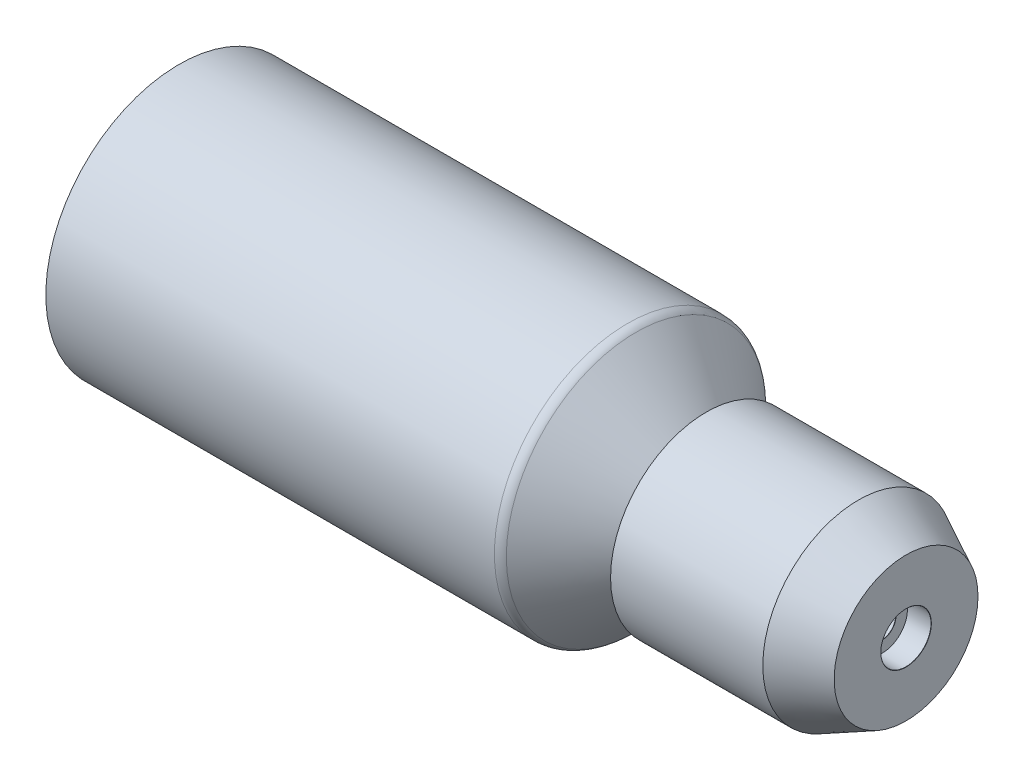
ISO-10303-21;
HEADER;
FILE_DESCRIPTION(('STEP AP214'),'2;1');
FILE_NAME('part.step','',(''),(''),'','','');
FILE_SCHEMA(('AUTOMOTIVE_DESIGN { 1 0 10303 214 1 1 1 1 }'));
ENDSEC;
DATA;
#1=APPLICATION_CONTEXT('core data for automotive mechanical design processes');
#2=APPLICATION_PROTOCOL_DEFINITION('international standard','automotive_design',2000,#1);
#3=PRODUCT_CONTEXT('',#1,'mechanical');
#4=PRODUCT('Part','Part','',(#3));
#5=PRODUCT_RELATED_PRODUCT_CATEGORY('part','',(#4));
#6=PRODUCT_DEFINITION_FORMATION('','',#4);
#7=PRODUCT_DEFINITION_CONTEXT('part definition',#1,'design');
#8=PRODUCT_DEFINITION('design','',#6,#7);
#9=PRODUCT_DEFINITION_SHAPE('','',#8);
#10=(LENGTH_UNIT() NAMED_UNIT(*) SI_UNIT(.MILLI.,.METRE.));
#11=(NAMED_UNIT(*) PLANE_ANGLE_UNIT() SI_UNIT($,.RADIAN.));
#12=(NAMED_UNIT(*) SI_UNIT($,.STERADIAN.) SOLID_ANGLE_UNIT());
#13=UNCERTAINTY_MEASURE_WITH_UNIT(LENGTH_MEASURE(1.E-05),#10,'distance_accuracy_value','');
#14=(GEOMETRIC_REPRESENTATION_CONTEXT(3) GLOBAL_UNCERTAINTY_ASSIGNED_CONTEXT((#13)) GLOBAL_UNIT_ASSIGNED_CONTEXT((#10,
#11,#12)) REPRESENTATION_CONTEXT('',''));
#15=CARTESIAN_POINT('',(0.,0.,0.));
#16=DIRECTION('',(0.,0.,1.));
#17=DIRECTION('',(1.,0.,0.));
#18=AXIS2_PLACEMENT_3D('',#15,#16,#17);
#19=CARTESIAN_POINT('',(-5.82137303331799,0.,0.));
#20=DIRECTION('',(-1.,0.,0.));
#21=DIRECTION('',(0.,0.,1.));
#22=AXIS2_PLACEMENT_3D('',#19,#20,#21);
#23=PLANE('',#22);
#24=CARTESIAN_POINT('',(-5.82137303331799,0.,0.));
#25=DIRECTION('',(-1.,0.,0.));
#26=DIRECTION('',(0.,0.,1.));
#27=AXIS2_PLACEMENT_3D('',#24,#25,#26);
#28=CIRCLE('',#27,1.8);
#29=CARTESIAN_POINT('',(-5.82137303331799,0.,1.8));
#30=VERTEX_POINT('',#29);
#31=EDGE_CURVE('E52',#30,#30,#28,.F.);
#32=ORIENTED_EDGE('',*,*,#31,.T.);
#33=EDGE_LOOP('',(#32));
#34=FACE_BOUND('',#33,.T.);
#35=CARTESIAN_POINT('',(-5.82137303331799,0.,0.));
#36=DIRECTION('',(1.,0.,0.));
#37=DIRECTION('',(0.,0.,-1.));
#38=AXIS2_PLACEMENT_3D('',#35,#36,#37);
#39=CIRCLE('',#38,12.7762);
#40=CARTESIAN_POINT('',(-5.82137303331799,0.,-12.7762));
#41=VERTEX_POINT('',#40);
#42=EDGE_CURVE('E71',#41,#41,#39,.T.);
#43=ORIENTED_EDGE('',*,*,#42,.F.);
#44=EDGE_LOOP('',(#43));
#45=FACE_BOUND('',#44,.T.);
#46=ADVANCED_FACE('F48',(#34,#45),#23,.T.);
#47=CARTESIAN_POINT('',(20.848626966682,0.,0.));
#48=DIRECTION('',(1.,0.,0.));
#49=DIRECTION('',(0.,0.,-1.));
#50=AXIS2_PLACEMENT_3D('',#47,#48,#49);
#51=CYLINDRICAL_SURFACE('',#50,3.35);
#52=CARTESIAN_POINT('',(17.673626966682,0.,0.));
#53=DIRECTION('',(1.,0.,0.));
#54=DIRECTION('',(0.,0.,-1.));
#55=AXIS2_PLACEMENT_3D('',#52,#53,#54);
#56=CIRCLE('',#55,3.35);
#57=CARTESIAN_POINT('',(17.673626966682,0.,-3.35));
#58=VERTEX_POINT('',#57);
#59=EDGE_CURVE('E60',#58,#58,#56,.T.);
#60=ORIENTED_EDGE('',*,*,#59,.F.);
#61=EDGE_LOOP('',(#60));
#62=FACE_BOUND('',#61,.T.);
#63=CARTESIAN_POINT('',(20.823626966682,0.,0.));
#64=DIRECTION('',(1.,0.,0.));
#65=DIRECTION('',(0.,0.,-1.));
#66=AXIS2_PLACEMENT_3D('',#63,#64,#65);
#67=CIRCLE('',#66,3.35);
#68=CARTESIAN_POINT('',(20.823626966682,0.,-3.35));
#69=VERTEX_POINT('',#68);
#70=EDGE_CURVE('E56',#69,#69,#67,.T.);
#71=ORIENTED_EDGE('',*,*,#70,.T.);
#72=EDGE_LOOP('',(#71));
#73=FACE_BOUND('',#72,.T.);
#74=ADVANCED_FACE('F100',(#62,#73),#51,.F.);
#75=CARTESIAN_POINT('',(17.673626966682,1.825,0.));
#76=DIRECTION('',(-1.,0.,0.));
#77=DIRECTION('',(0.,0.,1.));
#78=AXIS2_PLACEMENT_3D('',#75,#76,#77);
#79=PLANE('',#78);
#80=CARTESIAN_POINT('',(17.673626966682,0.,0.));
#81=DIRECTION('',(1.,0.,0.));
#82=DIRECTION('',(0.,0.,-1.));
#83=AXIS2_PLACEMENT_3D('',#80,#81,#82);
#84=CIRCLE('',#83,1.825);
#85=CARTESIAN_POINT('',(17.673626966682,0.,-1.825));
#86=VERTEX_POINT('',#85);
#87=EDGE_CURVE('E65',#86,#86,#84,.T.);
#88=ORIENTED_EDGE('',*,*,#87,.F.);
#89=EDGE_LOOP('',(#88));
#90=FACE_BOUND('',#89,.T.);
#91=ORIENTED_EDGE('',*,*,#59,.T.);
#92=EDGE_LOOP('',(#91));
#93=FACE_BOUND('',#92,.T.);
#94=ADVANCED_FACE('F97',(#90,#93),#79,.F.);
#95=CARTESIAN_POINT('',(17.673626966682,0.,0.));
#96=DIRECTION('',(1.,0.,0.));
#97=DIRECTION('',(0.,0.,-1.));
#98=AXIS2_PLACEMENT_3D('',#95,#96,#97);
#99=CONICAL_SURFACE('',#98,1.825,0.78539816339734);
#100=CARTESIAN_POINT('',(17.648626966682,0.,0.));
#101=DIRECTION('',(1.,0.,0.));
#102=DIRECTION('',(0.,0.,-1.));
#103=AXIS2_PLACEMENT_3D('',#100,#101,#102);
#104=CIRCLE('',#103,1.80000000000001);
#105=CARTESIAN_POINT('',(17.648626966682,0.,-1.80000000000001));
#106=VERTEX_POINT('',#105);
#107=EDGE_CURVE('E68',#106,#106,#104,.T.);
#108=ORIENTED_EDGE('',*,*,#107,.F.);
#109=EDGE_LOOP('',(#108));
#110=FACE_BOUND('',#109,.T.);
#111=ORIENTED_EDGE('',*,*,#87,.T.);
#112=EDGE_LOOP('',(#111));
#113=FACE_BOUND('',#112,.T.);
#114=ADVANCED_FACE('F88',(#110,#113),#99,.F.);
#115=CARTESIAN_POINT('',(-15.6638730333181,0.,0.));
#116=DIRECTION('',(-1.,0.,0.));
#117=DIRECTION('',(0.,0.,1.));
#118=AXIS2_PLACEMENT_3D('',#115,#116,#117);
#119=CYLINDRICAL_SURFACE('',#118,1.8);
#120=ORIENTED_EDGE('',*,*,#107,.T.);
#121=EDGE_LOOP('',(#120));
#122=FACE_BOUND('',#121,.T.);
#123=ORIENTED_EDGE('',*,*,#31,.F.);
#124=EDGE_LOOP('',(#123));
#125=FACE_BOUND('',#124,.T.);
#126=ADVANCED_FACE('F50',(#122,#125),#119,.F.);
#127=CARTESIAN_POINT('',(20.848626966682,0.,0.));
#128=DIRECTION('',(1.,0.,0.));
#129=DIRECTION('',(0.,0.,-1.));
#130=AXIS2_PLACEMENT_3D('',#127,#128,#129);
#131=CONICAL_SURFACE('',#130,3.375,0.785398163397518);
#132=ORIENTED_EDGE('',*,*,#70,.F.);
#133=EDGE_LOOP('',(#132));
#134=FACE_BOUND('',#133,.T.);
#135=CARTESIAN_POINT('',(20.848626966682,0.,0.));
#136=DIRECTION('',(1.,0.,0.));
#137=DIRECTION('',(0.,0.,-1.));
#138=AXIS2_PLACEMENT_3D('',#135,#136,#137);
#139=CIRCLE('',#138,3.375);
#140=CARTESIAN_POINT('',(20.848626966682,0.,-3.375));
#141=VERTEX_POINT('',#140);
#142=EDGE_CURVE('E12',#141,#141,#139,.T.);
#143=ORIENTED_EDGE('',*,*,#142,.T.);
#144=EDGE_LOOP('',(#143));
#145=FACE_BOUND('',#144,.T.);
#146=ADVANCED_FACE('F87',(#134,#145),#131,.F.);
#147=CARTESIAN_POINT('',(20.848626966682,12.7762,0.));
#148=DIRECTION('',(1.,0.,0.));
#149=DIRECTION('',(0.,0.,-1.));
#150=AXIS2_PLACEMENT_3D('',#147,#148,#149);
#151=PLANE('',#150);
#152=ORIENTED_EDGE('',*,*,#142,.F.);
#153=EDGE_LOOP('',(#152));
#154=FACE_BOUND('',#153,.T.);
#155=CARTESIAN_POINT('',(20.848626966682,0.,0.));
#156=DIRECTION('',(1.,0.,0.));
#157=DIRECTION('',(0.,0.,-1.));
#158=AXIS2_PLACEMENT_3D('',#155,#156,#157);
#159=CIRCLE('',#158,9.60119999999998);
#160=CARTESIAN_POINT('',(20.848626966682,0.,-9.60119999999998));
#161=VERTEX_POINT('',#160);
#162=EDGE_CURVE('E74',#161,#161,#159,.T.);
#163=ORIENTED_EDGE('',*,*,#162,.T.);
#164=EDGE_LOOP('',(#163));
#165=FACE_BOUND('',#164,.T.);
#166=ADVANCED_FACE('F94',(#154,#165),#151,.T.);
#167=CARTESIAN_POINT('',(20.848626966682,0.,0.));
#168=DIRECTION('',(-1.,0.,0.));
#169=DIRECTION('',(0.,0.,1.));
#170=AXIS2_PLACEMENT_3D('',#167,#168,#169);
#171=CONICAL_SURFACE('',#170,9.60119999999998,0.463647609000804);
#172=CARTESIAN_POINT('',(14.4986269666819,0.,0.));
#173=DIRECTION('',(1.,0.,0.));
#174=DIRECTION('',(0.,0.,-1.));
#175=AXIS2_PLACEMENT_3D('',#172,#173,#174);
#176=CIRCLE('',#175,12.7762);
#177=CARTESIAN_POINT('',(14.4986269666819,0.,-12.7762));
#178=VERTEX_POINT('',#177);
#179=EDGE_CURVE('E77',#178,#178,#176,.F.);
#180=ORIENTED_EDGE('',*,*,#179,.F.);
#181=EDGE_LOOP('',(#180));
#182=FACE_BOUND('',#181,.T.);
#183=ORIENTED_EDGE('',*,*,#162,.F.);
#184=EDGE_LOOP('',(#183));
#185=FACE_BOUND('',#184,.T.);
#186=ADVANCED_FACE('F116',(#182,#185),#171,.T.);
#187=CARTESIAN_POINT('',(24.17211464598,0.,0.));
#188=DIRECTION('',(1.,0.,0.));
#189=DIRECTION('',(0.,0.,-1.));
#190=AXIS2_PLACEMENT_3D('',#187,#188,#189);
#191=CYLINDRICAL_SURFACE('',#190,12.7762);
#192=ORIENTED_EDGE('',*,*,#179,.T.);
#193=EDGE_LOOP('',(#192));
#194=FACE_BOUND('',#193,.T.);
#195=ORIENTED_EDGE('',*,*,#42,.T.);
#196=EDGE_LOOP('',(#195));
#197=FACE_BOUND('',#196,.T.);
#198=ADVANCED_FACE('F110',(#194,#197),#191,.T.);
#199=CLOSED_SHELL('',(#46,#74,#94,#114,#126,#146,#166,#186,#198));
#200=MANIFOLD_SOLID_BREP('B2',#199);
#201=CARTESIAN_POINT('',(-5.82137303331799,0.,0.));
#202=DIRECTION('',(-1.,0.,0.));
#203=DIRECTION('',(0.,0.,1.));
#204=AXIS2_PLACEMENT_3D('',#201,#202,#203);
#205=PLANE('',#204);
#206=CARTESIAN_POINT('',(-5.82137303331799,0.,0.));
#207=DIRECTION('',(1.,0.,0.));
#208=DIRECTION('',(0.,0.,-1.));
#209=AXIS2_PLACEMENT_3D('',#206,#207,#208);
#210=CIRCLE('',#209,7.9375);
#211=CARTESIAN_POINT('',(-5.82137303331799,0.,-7.9375));
#212=VERTEX_POINT('',#211);
#213=EDGE_CURVE('E47',#212,#212,#210,.T.);
#214=ORIENTED_EDGE('',*,*,#213,.T.);
#215=EDGE_LOOP('',(#214));
#216=FACE_BOUND('',#215,.T.);
#217=CARTESIAN_POINT('',(-5.82137303331799,0.,0.));
#218=DIRECTION('',(-1.,0.,0.));
#219=DIRECTION('',(0.,0.,1.));
#220=AXIS2_PLACEMENT_3D('',#217,#218,#219);
#221=CIRCLE('',#220,1.8);
#222=CARTESIAN_POINT('',(-5.82137303331799,0.,1.8));
#223=VERTEX_POINT('',#222);
#224=EDGE_CURVE('E204',#223,#223,#221,.F.);
#225=ORIENTED_EDGE('',*,*,#224,.F.);
#226=EDGE_LOOP('',(#225));
#227=FACE_BOUND('',#226,.T.);
#228=ADVANCED_FACE('F201',(#216,#227),#205,.F.);
#229=CARTESIAN_POINT('',(-15.6638730333181,0.,0.));
#230=DIRECTION('',(-1.,0.,0.));
#231=DIRECTION('',(0.,0.,1.));
#232=AXIS2_PLACEMENT_3D('',#229,#230,#231);
#233=CYLINDRICAL_SURFACE('',#232,1.8);
#234=ORIENTED_EDGE('',*,*,#224,.T.);
#235=EDGE_LOOP('',(#234));
#236=FACE_BOUND('',#235,.T.);
#237=CARTESIAN_POINT('',(-14.0138730333181,0.,0.));
#238=DIRECTION('',(-1.,0.,0.));
#239=DIRECTION('',(0.,0.,1.));
#240=AXIS2_PLACEMENT_3D('',#237,#238,#239);
#241=CIRCLE('',#240,1.8);
#242=CARTESIAN_POINT('',(-14.0138730333181,0.,1.8));
#243=VERTEX_POINT('',#242);
#244=EDGE_CURVE('E357',#243,#243,#241,.T.);
#245=ORIENTED_EDGE('',*,*,#244,.T.);
#246=EDGE_LOOP('',(#245));
#247=FACE_BOUND('',#246,.T.);
#248=ADVANCED_FACE('F233',(#236,#247),#233,.F.);
#249=CARTESIAN_POINT('',(24.17211464598,0.,0.));
#250=DIRECTION('',(1.,0.,0.));
#251=DIRECTION('',(0.,0.,-1.));
#252=AXIS2_PLACEMENT_3D('',#249,#250,#251);
#253=CYLINDRICAL_SURFACE('',#252,11.43);
#254=CARTESIAN_POINT('',(-15.6638730333181,0.,0.));
#255=DIRECTION('',(1.,0.,0.));
#256=DIRECTION('',(0.,0.,-1.));
#257=AXIS2_PLACEMENT_3D('',#254,#255,#256);
#258=CIRCLE('',#257,11.43);
#259=CARTESIAN_POINT('',(-15.6638730333181,0.,-11.43));
#260=VERTEX_POINT('',#259);
#261=EDGE_CURVE('E215',#260,#260,#258,.T.);
#262=ORIENTED_EDGE('',*,*,#261,.T.);
#263=EDGE_LOOP('',(#262));
#264=FACE_BOUND('',#263,.T.);
#265=CARTESIAN_POINT('',(-76.2,0.,0.));
#266=DIRECTION('',(1.,0.,0.));
#267=DIRECTION('',(0.,0.,-1.));
#268=AXIS2_PLACEMENT_3D('',#265,#266,#267);
#269=CIRCLE('',#268,11.43);
#270=CARTESIAN_POINT('',(-76.2,0.,-11.43));
#271=VERTEX_POINT('',#270);
#272=EDGE_CURVE('E212',#271,#271,#269,.T.);
#273=ORIENTED_EDGE('',*,*,#272,.F.);
#274=EDGE_LOOP('',(#273));
#275=FACE_BOUND('',#274,.T.);
#276=ADVANCED_FACE('F231',(#264,#275),#253,.F.);
#277=CARTESIAN_POINT('',(-76.2,17.78,0.));
#278=DIRECTION('',(-1.,0.,0.));
#279=DIRECTION('',(0.,0.,1.));
#280=AXIS2_PLACEMENT_3D('',#277,#278,#279);
#281=PLANE('',#280);
#282=ORIENTED_EDGE('',*,*,#272,.T.);
#283=EDGE_LOOP('',(#282));
#284=FACE_BOUND('',#283,.T.);
#285=CARTESIAN_POINT('',(-76.2,0.,0.));
#286=DIRECTION('',(1.,0.,0.));
#287=DIRECTION('',(0.,0.,-1.));
#288=AXIS2_PLACEMENT_3D('',#285,#286,#287);
#289=CIRCLE('',#288,17.78);
#290=CARTESIAN_POINT('',(-76.2,0.,-17.78));
#291=VERTEX_POINT('',#290);
#292=EDGE_CURVE('E223',#291,#291,#289,.T.);
#293=ORIENTED_EDGE('',*,*,#292,.F.);
#294=EDGE_LOOP('',(#293));
#295=FACE_BOUND('',#294,.T.);
#296=ADVANCED_FACE('F228',(#284,#295),#281,.T.);
#297=CARTESIAN_POINT('',(24.17211464598,0.,0.));
#298=DIRECTION('',(1.,0.,0.));
#299=DIRECTION('',(0.,0.,-1.));
#300=AXIS2_PLACEMENT_3D('',#297,#298,#299);
#301=CYLINDRICAL_SURFACE('',#300,17.78);
#302=ORIENTED_EDGE('',*,*,#292,.T.);
#303=EDGE_LOOP('',(#302));
#304=FACE_BOUND('',#303,.T.);
#305=CARTESIAN_POINT('',(-16.3214370635854,0.,0.));
#306=DIRECTION('',(1.,0.,0.));
#307=DIRECTION('',(0.,0.,-1.));
#308=AXIS2_PLACEMENT_3D('',#305,#306,#307);
#309=CIRCLE('',#308,17.78);
#310=CARTESIAN_POINT('',(-16.3214370635854,0.,-17.78));
#311=VERTEX_POINT('',#310);
#312=EDGE_CURVE('E220',#311,#311,#309,.T.);
#313=ORIENTED_EDGE('',*,*,#312,.F.);
#314=EDGE_LOOP('',(#313));
#315=FACE_BOUND('',#314,.T.);
#316=ADVANCED_FACE('F239',(#304,#315),#301,.T.);
#317=CARTESIAN_POINT('',(-16.3214370635854,0.,0.));
#318=DIRECTION('',(1.,0.,0.));
#319=DIRECTION('',(0.,0.,-1.));
#320=AXIS2_PLACEMENT_3D('',#317,#318,#319);
#321=TOROIDAL_SURFACE('',#320,16.1925,1.58749999999999);
#322=ORIENTED_EDGE('',*,*,#312,.T.);
#323=EDGE_LOOP('',(#322));
#324=FACE_BOUND('',#323,.T.);
#325=CARTESIAN_POINT('',(-15.1989050484517,0.,0.));
#326=DIRECTION('',(1.,0.,0.));
#327=DIRECTION('',(0.,0.,-1.));
#328=AXIS2_PLACEMENT_3D('',#325,#326,#327);
#329=CIRCLE('',#328,17.3150320151336);
#330=CARTESIAN_POINT('',(-15.1989050484517,0.,-17.3150320151336));
#331=VERTEX_POINT('',#330);
#332=EDGE_CURVE('E217',#331,#331,#329,.T.);
#333=ORIENTED_EDGE('',*,*,#332,.F.);
#334=EDGE_LOOP('',(#333));
#335=FACE_BOUND('',#334,.T.);
#336=ADVANCED_FACE('F272',(#324,#335),#321,.T.);
#337=CARTESIAN_POINT('',(-5.82137303331799,0.,0.));
#338=DIRECTION('',(-1.,0.,0.));
#339=DIRECTION('',(0.,0.,1.));
#340=AXIS2_PLACEMENT_3D('',#337,#338,#339);
#341=CONICAL_SURFACE('',#340,7.9375,0.785398163397442);
#342=ORIENTED_EDGE('',*,*,#332,.T.);
#343=EDGE_LOOP('',(#342));
#344=FACE_BOUND('',#343,.T.);
#345=ORIENTED_EDGE('',*,*,#213,.F.);
#346=EDGE_LOOP('',(#345));
#347=FACE_BOUND('',#346,.T.);
#348=ADVANCED_FACE('F268',(#344,#347),#341,.T.);
#349=CARTESIAN_POINT('',(-15.6638730333181,11.43,0.));
#350=DIRECTION('',(-1.,0.,0.));
#351=DIRECTION('',(0.,0.,1.));
#352=AXIS2_PLACEMENT_3D('',#349,#350,#351);
#353=PLANE('',#352);
#354=CARTESIAN_POINT('',(-15.6638730333181,0.,0.));
#355=DIRECTION('',(-1.,0.,0.));
#356=DIRECTION('',(0.,0.,1.));
#357=AXIS2_PLACEMENT_3D('',#354,#355,#356);
#358=CIRCLE('',#357,3.375);
#359=CARTESIAN_POINT('',(-15.6638730333181,0.,3.375));
#360=VERTEX_POINT('',#359);
#361=EDGE_CURVE('E355',#360,#360,#358,.T.);
#362=ORIENTED_EDGE('',*,*,#361,.F.);
#363=EDGE_LOOP('',(#362));
#364=FACE_BOUND('',#363,.T.);
#365=ORIENTED_EDGE('',*,*,#261,.F.);
#366=EDGE_LOOP('',(#365));
#367=FACE_BOUND('',#366,.T.);
#368=ADVANCED_FACE('F263',(#364,#367),#353,.T.);
#369=CARTESIAN_POINT('',(-14.0138730333181,3.35,0.));
#370=DIRECTION('',(1.,0.,0.));
#371=DIRECTION('',(0.,0.,-1.));
#372=AXIS2_PLACEMENT_3D('',#369,#370,#371);
#373=PLANE('',#372);
#374=ORIENTED_EDGE('',*,*,#244,.F.);
#375=EDGE_LOOP('',(#374));
#376=FACE_BOUND('',#375,.T.);
#377=CARTESIAN_POINT('',(-14.0138730333181,0.,0.));
#378=DIRECTION('',(-1.,0.,0.));
#379=DIRECTION('',(0.,0.,1.));
#380=AXIS2_PLACEMENT_3D('',#377,#378,#379);
#381=CIRCLE('',#380,3.35);
#382=CARTESIAN_POINT('',(-14.0138730333181,0.,3.35));
#383=VERTEX_POINT('',#382);
#384=EDGE_CURVE('E359',#383,#383,#381,.T.);
#385=ORIENTED_EDGE('',*,*,#384,.T.);
#386=EDGE_LOOP('',(#385));
#387=FACE_BOUND('',#386,.T.);
#388=ADVANCED_FACE('F256',(#376,#387),#373,.F.);
#389=CARTESIAN_POINT('',(-15.6638730333181,0.,0.));
#390=DIRECTION('',(-1.,0.,0.));
#391=DIRECTION('',(0.,0.,1.));
#392=AXIS2_PLACEMENT_3D('',#389,#390,#391);
#393=CYLINDRICAL_SURFACE('',#392,3.35);
#394=ORIENTED_EDGE('',*,*,#384,.F.);
#395=EDGE_LOOP('',(#394));
#396=FACE_BOUND('',#395,.T.);
#397=CARTESIAN_POINT('',(-15.6388730333181,0.,0.));
#398=DIRECTION('',(-1.,0.,0.));
#399=DIRECTION('',(0.,0.,1.));
#400=AXIS2_PLACEMENT_3D('',#397,#398,#399);
#401=CIRCLE('',#400,3.35);
#402=CARTESIAN_POINT('',(-15.6388730333181,0.,3.35));
#403=VERTEX_POINT('',#402);
#404=EDGE_CURVE('E363',#403,#403,#401,.T.);
#405=ORIENTED_EDGE('',*,*,#404,.T.);
#406=EDGE_LOOP('',(#405));
#407=FACE_BOUND('',#406,.T.);
#408=ADVANCED_FACE('F250',(#396,#407),#393,.F.);
#409=CARTESIAN_POINT('',(-15.6638730333181,0.,0.));
#410=DIRECTION('',(-1.,0.,0.));
#411=DIRECTION('',(0.,0.,1.));
#412=AXIS2_PLACEMENT_3D('',#409,#410,#411);
#413=CONICAL_SURFACE('',#412,3.375,0.785398163397405);
#414=ORIENTED_EDGE('',*,*,#404,.F.);
#415=EDGE_LOOP('',(#414));
#416=FACE_BOUND('',#415,.T.);
#417=ORIENTED_EDGE('',*,*,#361,.T.);
#418=EDGE_LOOP('',(#417));
#419=FACE_BOUND('',#418,.T.);
#420=ADVANCED_FACE('F245',(#416,#419),#413,.F.);
#421=CLOSED_SHELL('',(#228,#248,#276,#296,#316,#336,#348,#368,#388,#408,#420));
#422=MANIFOLD_SOLID_BREP('B7',#421);
#423=ADVANCED_BREP_SHAPE_REPRESENTATION('',(#18,#200,#422),#14);
#424=SHAPE_DEFINITION_REPRESENTATION(#9,#423);
ENDSEC;
END-ISO-10303-21;
